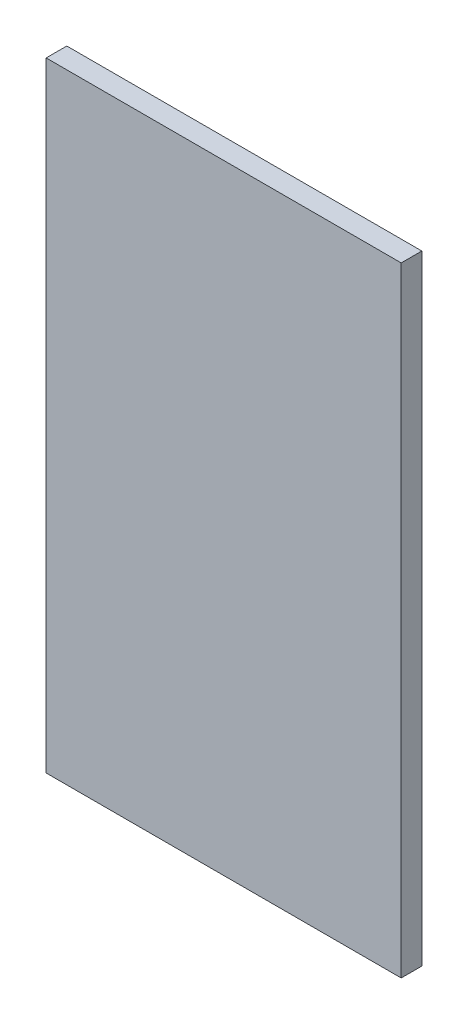
ISO-10303-21;
HEADER;
FILE_DESCRIPTION(('STEP AP214'),'2;1');
FILE_NAME('part.step','',(''),(''),'','','');
FILE_SCHEMA(('AUTOMOTIVE_DESIGN { 1 0 10303 214 1 1 1 1 }'));
ENDSEC;
DATA;
#1=APPLICATION_CONTEXT('core data for automotive mechanical design processes');
#2=APPLICATION_PROTOCOL_DEFINITION('international standard','automotive_design',2000,#1);
#3=PRODUCT_CONTEXT('',#1,'mechanical');
#4=PRODUCT('Part','Part','',(#3));
#5=PRODUCT_RELATED_PRODUCT_CATEGORY('part','',(#4));
#6=PRODUCT_DEFINITION_FORMATION('','',#4);
#7=PRODUCT_DEFINITION_CONTEXT('part definition',#1,'design');
#8=PRODUCT_DEFINITION('design','',#6,#7);
#9=PRODUCT_DEFINITION_SHAPE('','',#8);
#10=(LENGTH_UNIT() NAMED_UNIT(*) SI_UNIT(.MILLI.,.METRE.));
#11=(NAMED_UNIT(*) PLANE_ANGLE_UNIT() SI_UNIT($,.RADIAN.));
#12=(NAMED_UNIT(*) SI_UNIT($,.STERADIAN.) SOLID_ANGLE_UNIT());
#13=UNCERTAINTY_MEASURE_WITH_UNIT(LENGTH_MEASURE(1.E-05),#10,'distance_accuracy_value','');
#14=(GEOMETRIC_REPRESENTATION_CONTEXT(3) GLOBAL_UNCERTAINTY_ASSIGNED_CONTEXT((#13)) GLOBAL_UNIT_ASSIGNED_CONTEXT((#10,
#11,#12)) REPRESENTATION_CONTEXT('',''));
#15=CARTESIAN_POINT('',(0.,0.,0.));
#16=DIRECTION('',(0.,0.,1.));
#17=DIRECTION('',(1.,0.,0.));
#18=AXIS2_PLACEMENT_3D('',#15,#16,#17);
#19=CARTESIAN_POINT('',(0.,0.,10.));
#20=DIRECTION('',(1.,0.,0.));
#21=DIRECTION('',(0.,0.,-1.));
#22=AXIS2_PLACEMENT_3D('',#19,#20,#21);
#23=PLANE('',#22);
#24=DIRECTION('',(0.,-1.,0.));
#25=VECTOR('',#24,1.);
#26=CARTESIAN_POINT('',(0.,0.,0.));
#27=LINE('',#26,#25);
#28=CARTESIAN_POINT('',(0.,300.,0.));
#29=VERTEX_POINT('',#28);
#30=CARTESIAN_POINT('',(0.,0.,0.));
#31=VERTEX_POINT('',#30);
#32=EDGE_CURVE('E97',#29,#31,#27,.T.);
#33=ORIENTED_EDGE('',*,*,#32,.T.);
#34=DIRECTION('',(0.,0.,-1.));
#35=VECTOR('',#34,1.);
#36=CARTESIAN_POINT('',(0.,0.,10.));
#37=LINE('',#36,#35);
#38=CARTESIAN_POINT('',(0.,0.,10.));
#39=VERTEX_POINT('',#38);
#40=EDGE_CURVE('E11',#39,#31,#37,.T.);
#41=ORIENTED_EDGE('',*,*,#40,.F.);
#42=DIRECTION('',(0.,-1.,0.));
#43=VECTOR('',#42,1.);
#44=CARTESIAN_POINT('',(0.,0.,10.));
#45=LINE('',#44,#43);
#46=CARTESIAN_POINT('',(0.,300.,10.));
#47=VERTEX_POINT('',#46);
#48=EDGE_CURVE('E85',#47,#39,#45,.T.);
#49=ORIENTED_EDGE('',*,*,#48,.F.);
#50=DIRECTION('',(0.,0.,-1.));
#51=VECTOR('',#50,1.);
#52=CARTESIAN_POINT('',(0.,300.,10.));
#53=LINE('',#52,#51);
#54=EDGE_CURVE('E93',#47,#29,#53,.T.);
#55=ORIENTED_EDGE('',*,*,#54,.T.);
#56=EDGE_LOOP('',(#33,#41,#49,#55));
#57=FACE_BOUND('',#56,.T.);
#58=ADVANCED_FACE('F34',(#57),#23,.F.);
#59=CARTESIAN_POINT('',(0.,0.,10.));
#60=DIRECTION('',(0.,1.,0.));
#61=DIRECTION('',(0.,0.,1.));
#62=AXIS2_PLACEMENT_3D('',#59,#60,#61);
#63=PLANE('',#62);
#64=DIRECTION('',(1.,0.,0.));
#65=VECTOR('',#64,1.);
#66=CARTESIAN_POINT('',(0.,0.,0.));
#67=LINE('',#66,#65);
#68=CARTESIAN_POINT('',(172.,0.,0.));
#69=VERTEX_POINT('',#68);
#70=EDGE_CURVE('E89',#31,#69,#67,.T.);
#71=ORIENTED_EDGE('',*,*,#70,.T.);
#72=DIRECTION('',(0.,0.,-1.));
#73=VECTOR('',#72,1.);
#74=CARTESIAN_POINT('',(172.,0.,10.));
#75=LINE('',#74,#73);
#76=CARTESIAN_POINT('',(172.,0.,10.));
#77=VERTEX_POINT('',#76);
#78=EDGE_CURVE('E42',#77,#69,#75,.T.);
#79=ORIENTED_EDGE('',*,*,#78,.F.);
#80=DIRECTION('',(1.,0.,0.));
#81=VECTOR('',#80,1.);
#82=CARTESIAN_POINT('',(0.,0.,10.));
#83=LINE('',#82,#81);
#84=EDGE_CURVE('E80',#39,#77,#83,.T.);
#85=ORIENTED_EDGE('',*,*,#84,.F.);
#86=ORIENTED_EDGE('',*,*,#40,.T.);
#87=EDGE_LOOP('',(#71,#79,#85,#86));
#88=FACE_BOUND('',#87,.T.);
#89=ADVANCED_FACE('F88',(#88),#63,.F.);
#90=CARTESIAN_POINT('',(172.,0.,10.));
#91=DIRECTION('',(-1.,0.,0.));
#92=DIRECTION('',(0.,0.,1.));
#93=AXIS2_PLACEMENT_3D('',#90,#91,#92);
#94=PLANE('',#93);
#95=DIRECTION('',(0.,1.,0.));
#96=VECTOR('',#95,1.);
#97=CARTESIAN_POINT('',(172.,0.,0.));
#98=LINE('',#97,#96);
#99=CARTESIAN_POINT('',(172.,300.,0.));
#100=VERTEX_POINT('',#99);
#101=EDGE_CURVE('E67',#69,#100,#98,.T.);
#102=ORIENTED_EDGE('',*,*,#101,.T.);
#103=DIRECTION('',(0.,0.,-1.));
#104=VECTOR('',#103,1.);
#105=CARTESIAN_POINT('',(172.,300.,10.));
#106=LINE('',#105,#104);
#107=CARTESIAN_POINT('',(172.,300.,10.));
#108=VERTEX_POINT('',#107);
#109=EDGE_CURVE('E90',#108,#100,#106,.T.);
#110=ORIENTED_EDGE('',*,*,#109,.F.);
#111=DIRECTION('',(0.,1.,0.));
#112=VECTOR('',#111,1.);
#113=CARTESIAN_POINT('',(172.,0.,10.));
#114=LINE('',#113,#112);
#115=EDGE_CURVE('E83',#77,#108,#114,.T.);
#116=ORIENTED_EDGE('',*,*,#115,.F.);
#117=ORIENTED_EDGE('',*,*,#78,.T.);
#118=EDGE_LOOP('',(#102,#110,#116,#117));
#119=FACE_BOUND('',#118,.T.);
#120=ADVANCED_FACE('F91',(#119),#94,.F.);
#121=CARTESIAN_POINT('',(0.,300.,10.));
#122=DIRECTION('',(0.,-1.,0.));
#123=DIRECTION('',(0.,0.,-1.));
#124=AXIS2_PLACEMENT_3D('',#121,#122,#123);
#125=PLANE('',#124);
#126=DIRECTION('',(-1.,0.,0.));
#127=VECTOR('',#126,1.);
#128=CARTESIAN_POINT('',(0.,300.,0.));
#129=LINE('',#128,#127);
#130=EDGE_CURVE('E73',#100,#29,#129,.T.);
#131=ORIENTED_EDGE('',*,*,#130,.T.);
#132=ORIENTED_EDGE('',*,*,#54,.F.);
#133=DIRECTION('',(-1.,0.,0.));
#134=VECTOR('',#133,1.);
#135=CARTESIAN_POINT('',(0.,300.,10.));
#136=LINE('',#135,#134);
#137=EDGE_CURVE('E50',#108,#47,#136,.T.);
#138=ORIENTED_EDGE('',*,*,#137,.F.);
#139=ORIENTED_EDGE('',*,*,#109,.T.);
#140=EDGE_LOOP('',(#131,#132,#138,#139));
#141=FACE_BOUND('',#140,.T.);
#142=ADVANCED_FACE('F104',(#141),#125,.F.);
#143=CARTESIAN_POINT('',(0.,0.,10.));
#144=DIRECTION('',(0.,0.,-1.));
#145=DIRECTION('',(-1.,0.,0.));
#146=AXIS2_PLACEMENT_3D('',#143,#144,#145);
#147=PLANE('',#146);
#148=ORIENTED_EDGE('',*,*,#48,.T.);
#149=ORIENTED_EDGE('',*,*,#84,.T.);
#150=ORIENTED_EDGE('',*,*,#115,.T.);
#151=ORIENTED_EDGE('',*,*,#137,.T.);
#152=EDGE_LOOP('',(#148,#149,#150,#151));
#153=FACE_BOUND('',#152,.T.);
#154=ADVANCED_FACE('F81',(#153),#147,.F.);
#155=CARTESIAN_POINT('',(0.,0.,0.));
#156=DIRECTION('',(0.,0.,-1.));
#157=DIRECTION('',(-1.,0.,0.));
#158=AXIS2_PLACEMENT_3D('',#155,#156,#157);
#159=PLANE('',#158);
#160=ORIENTED_EDGE('',*,*,#32,.F.);
#161=ORIENTED_EDGE('',*,*,#130,.F.);
#162=ORIENTED_EDGE('',*,*,#101,.F.);
#163=ORIENTED_EDGE('',*,*,#70,.F.);
#164=EDGE_LOOP('',(#160,#161,#162,#163));
#165=FACE_BOUND('',#164,.T.);
#166=ADVANCED_FACE('F107',(#165),#159,.T.);
#167=CLOSED_SHELL('',(#58,#89,#120,#142,#154,#166));
#168=MANIFOLD_SOLID_BREP('B2',#167);
#169=ADVANCED_BREP_SHAPE_REPRESENTATION('',(#18,#168),#14);
#170=SHAPE_DEFINITION_REPRESENTATION(#9,#169);
ENDSEC;
END-ISO-10303-21;
